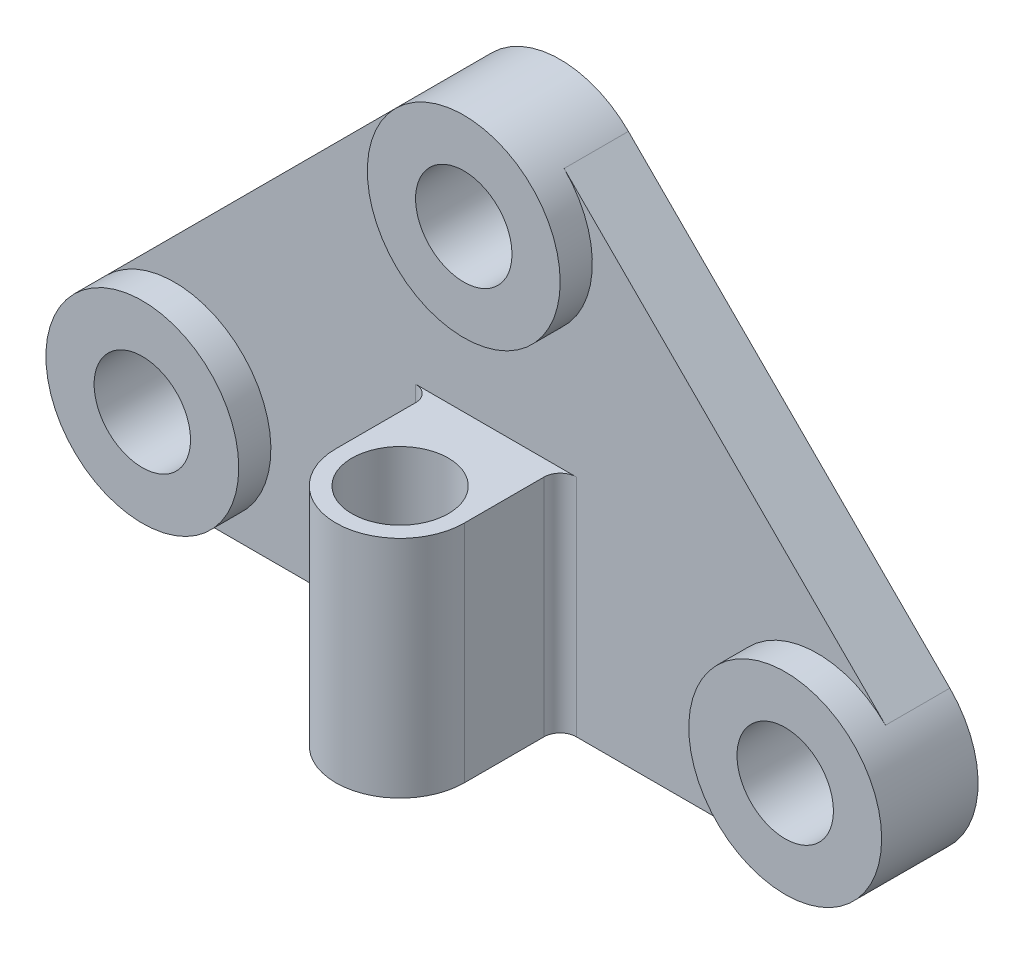
ISO-10303-21;
HEADER;
FILE_DESCRIPTION(('STEP AP214'),'2;1');
FILE_NAME('part.step','',(''),(''),'','','');
FILE_SCHEMA(('AUTOMOTIVE_DESIGN { 1 0 10303 214 1 1 1 1 }'));
ENDSEC;
DATA;
#1=APPLICATION_CONTEXT('core data for automotive mechanical design processes');
#2=APPLICATION_PROTOCOL_DEFINITION('international standard','automotive_design',2000,#1);
#3=PRODUCT_CONTEXT('',#1,'mechanical');
#4=PRODUCT('Part','Part','',(#3));
#5=PRODUCT_RELATED_PRODUCT_CATEGORY('part','',(#4));
#6=PRODUCT_DEFINITION_FORMATION('','',#4);
#7=PRODUCT_DEFINITION_CONTEXT('part definition',#1,'design');
#8=PRODUCT_DEFINITION('design','',#6,#7);
#9=PRODUCT_DEFINITION_SHAPE('','',#8);
#10=(LENGTH_UNIT() NAMED_UNIT(*) SI_UNIT(.MILLI.,.METRE.));
#11=(NAMED_UNIT(*) PLANE_ANGLE_UNIT() SI_UNIT($,.RADIAN.));
#12=(NAMED_UNIT(*) SI_UNIT($,.STERADIAN.) SOLID_ANGLE_UNIT());
#13=UNCERTAINTY_MEASURE_WITH_UNIT(LENGTH_MEASURE(1.E-05),#10,'distance_accuracy_value','');
#14=(GEOMETRIC_REPRESENTATION_CONTEXT(3) GLOBAL_UNCERTAINTY_ASSIGNED_CONTEXT((#13)) GLOBAL_UNIT_ASSIGNED_CONTEXT((#10,
#11,#12)) REPRESENTATION_CONTEXT('',''));
#15=CARTESIAN_POINT('',(0.,0.,0.));
#16=DIRECTION('',(0.,0.,1.));
#17=DIRECTION('',(1.,0.,0.));
#18=AXIS2_PLACEMENT_3D('',#15,#16,#17);
#19=CARTESIAN_POINT('',(-100.,0.,20.));
#20=DIRECTION('',(0.,0.,1.));
#21=DIRECTION('',(1.,0.,0.));
#22=AXIS2_PLACEMENT_3D('',#19,#20,#21);
#23=PLANE('',#22);
#24=DIRECTION('',(1.,0.,0.));
#25=VECTOR('',#24,1.);
#26=CARTESIAN_POINT('',(-100.,-30.,20.));
#27=LINE('',#26,#25);
#28=CARTESIAN_POINT('',(-100.,-30.,20.));
#29=VERTEX_POINT('',#28);
#30=CARTESIAN_POINT('',(-25.,-30.,20.));
#31=VERTEX_POINT('',#30);
#32=EDGE_CURVE('E197',#29,#31,#27,.T.);
#33=ORIENTED_EDGE('',*,*,#32,.T.);
#34=DIRECTION('',(0.,-1.,0.));
#35=VECTOR('',#34,1.);
#36=CARTESIAN_POINT('',(-25.,40.,20.));
#37=LINE('',#36,#35);
#38=CARTESIAN_POINT('',(-25.,40.,20.));
#39=VERTEX_POINT('',#38);
#40=EDGE_CURVE('E244',#31,#39,#37,.F.);
#41=ORIENTED_EDGE('',*,*,#40,.T.);
#42=DIRECTION('',(1.,0.,0.));
#43=VECTOR('',#42,1.);
#44=CARTESIAN_POINT('',(20.,40.,20.));
#45=LINE('',#44,#43);
#46=CARTESIAN_POINT('',(25.,40.,20.));
#47=VERTEX_POINT('',#46);
#48=EDGE_CURVE('E47',#39,#47,#45,.T.);
#49=ORIENTED_EDGE('',*,*,#48,.T.);
#50=DIRECTION('',(0.,-1.,0.));
#51=VECTOR('',#50,1.);
#52=CARTESIAN_POINT('',(25.,-30.,20.));
#53=LINE('',#52,#51);
#54=CARTESIAN_POINT('',(25.,-30.,20.));
#55=VERTEX_POINT('',#54);
#56=EDGE_CURVE('E186',#47,#55,#53,.T.);
#57=ORIENTED_EDGE('',*,*,#56,.T.);
#58=CARTESIAN_POINT('',(100.,-30.,20.));
#59=VERTEX_POINT('',#58);
#60=EDGE_CURVE('E200',#55,#59,#27,.T.);
#61=ORIENTED_EDGE('',*,*,#60,.T.);
#62=CARTESIAN_POINT('',(100.,0.,20.));
#63=DIRECTION('',(0.,0.,1.));
#64=DIRECTION('',(1.,0.,0.));
#65=AXIS2_PLACEMENT_3D('',#62,#63,#64);
#66=CIRCLE('',#65,30.);
#67=CARTESIAN_POINT('',(121.213203435596,21.2132034355964,20.));
#68=VERTEX_POINT('',#67);
#69=EDGE_CURVE('E170',#68,#59,#66,.T.);
#70=ORIENTED_EDGE('',*,*,#69,.F.);
#71=DIRECTION('',(-0.707106781186547,0.707106781186547,0.));
#72=VECTOR('',#71,1.);
#73=CARTESIAN_POINT('',(121.213203435596,21.2132034355964,20.));
#74=LINE('',#73,#72);
#75=CARTESIAN_POINT('',(21.2132034355964,121.213203435596,20.));
#76=VERTEX_POINT('',#75);
#77=EDGE_CURVE('E199',#68,#76,#74,.T.);
#78=ORIENTED_EDGE('',*,*,#77,.T.);
#79=CARTESIAN_POINT('',(0.,100.,20.));
#80=DIRECTION('',(0.,0.,1.));
#81=DIRECTION('',(1.,0.,0.));
#82=AXIS2_PLACEMENT_3D('',#79,#80,#81);
#83=CIRCLE('',#82,30.);
#84=CARTESIAN_POINT('',(-21.2132034355964,121.213203435596,20.));
#85=VERTEX_POINT('',#84);
#86=EDGE_CURVE('E161',#85,#76,#83,.T.);
#87=ORIENTED_EDGE('',*,*,#86,.F.);
#88=DIRECTION('',(-0.707106781186547,-0.707106781186547,0.));
#89=VECTOR('',#88,1.);
#90=CARTESIAN_POINT('',(-121.213203435596,21.2132034355964,20.));
#91=LINE('',#90,#89);
#92=CARTESIAN_POINT('',(-121.213203435596,21.2132034355964,20.));
#93=VERTEX_POINT('',#92);
#94=EDGE_CURVE('E202',#85,#93,#91,.T.);
#95=ORIENTED_EDGE('',*,*,#94,.T.);
#96=CARTESIAN_POINT('',(-100.,0.,20.));
#97=DIRECTION('',(0.,0.,1.));
#98=DIRECTION('',(1.,0.,0.));
#99=AXIS2_PLACEMENT_3D('',#96,#97,#98);
#100=CIRCLE('',#99,30.);
#101=EDGE_CURVE('E183',#29,#93,#100,.T.);
#102=ORIENTED_EDGE('',*,*,#101,.F.);
#103=EDGE_LOOP('',(#33,#41,#49,#57,#61,#70,#78,#87,#95,#102));
#104=FACE_BOUND('',#103,.T.);
#105=ADVANCED_FACE('F33',(#104),#23,.T.);
#106=CARTESIAN_POINT('',(-100.,0.,0.));
#107=DIRECTION('',(0.,0.,1.));
#108=DIRECTION('',(1.,0.,0.));
#109=AXIS2_PLACEMENT_3D('',#106,#107,#108);
#110=PLANE('',#109);
#111=CARTESIAN_POINT('',(-100.,0.,0.));
#112=DIRECTION('',(0.,0.,1.));
#113=DIRECTION('',(1.,0.,0.));
#114=AXIS2_PLACEMENT_3D('',#111,#112,#113);
#115=CIRCLE('',#114,30.);
#116=CARTESIAN_POINT('',(-121.213203435596,21.2132034355964,0.));
#117=VERTEX_POINT('',#116);
#118=CARTESIAN_POINT('',(-100.,-30.,0.));
#119=VERTEX_POINT('',#118);
#120=EDGE_CURVE('E196',#117,#119,#115,.T.);
#121=ORIENTED_EDGE('',*,*,#120,.F.);
#122=DIRECTION('',(-0.707106781186547,-0.707106781186547,0.));
#123=VECTOR('',#122,1.);
#124=CARTESIAN_POINT('',(-121.213203435596,21.2132034355964,0.));
#125=LINE('',#124,#123);
#126=CARTESIAN_POINT('',(-21.2132034355964,121.213203435596,0.));
#127=VERTEX_POINT('',#126);
#128=EDGE_CURVE('E216',#127,#117,#125,.T.);
#129=ORIENTED_EDGE('',*,*,#128,.F.);
#130=CARTESIAN_POINT('',(0.,100.,0.));
#131=DIRECTION('',(0.,0.,1.));
#132=DIRECTION('',(1.,0.,0.));
#133=AXIS2_PLACEMENT_3D('',#130,#131,#132);
#134=CIRCLE('',#133,30.);
#135=CARTESIAN_POINT('',(21.2132034355964,121.213203435596,0.));
#136=VERTEX_POINT('',#135);
#137=EDGE_CURVE('E214',#136,#127,#134,.T.);
#138=ORIENTED_EDGE('',*,*,#137,.F.);
#139=DIRECTION('',(-0.707106781186547,0.707106781186547,0.));
#140=VECTOR('',#139,1.);
#141=CARTESIAN_POINT('',(121.213203435596,21.2132034355964,0.));
#142=LINE('',#141,#140);
#143=CARTESIAN_POINT('',(121.213203435596,21.2132034355964,0.));
#144=VERTEX_POINT('',#143);
#145=EDGE_CURVE('E212',#144,#136,#142,.T.);
#146=ORIENTED_EDGE('',*,*,#145,.F.);
#147=CARTESIAN_POINT('',(100.,0.,0.));
#148=DIRECTION('',(0.,0.,1.));
#149=DIRECTION('',(1.,0.,0.));
#150=AXIS2_PLACEMENT_3D('',#147,#148,#149);
#151=CIRCLE('',#150,30.);
#152=CARTESIAN_POINT('',(100.,-30.,0.));
#153=VERTEX_POINT('',#152);
#154=EDGE_CURVE('E210',#153,#144,#151,.T.);
#155=ORIENTED_EDGE('',*,*,#154,.F.);
#156=DIRECTION('',(1.,0.,0.));
#157=VECTOR('',#156,1.);
#158=CARTESIAN_POINT('',(-100.,-30.,0.));
#159=LINE('',#158,#157);
#160=EDGE_CURVE('E208',#119,#153,#159,.T.);
#161=ORIENTED_EDGE('',*,*,#160,.F.);
#162=EDGE_LOOP('',(#121,#129,#138,#146,#155,#161));
#163=FACE_BOUND('',#162,.T.);
#164=CARTESIAN_POINT('',(100.,0.,0.));
#165=DIRECTION('',(0.,0.,1.));
#166=DIRECTION('',(1.,0.,0.));
#167=AXIS2_PLACEMENT_3D('',#164,#165,#166);
#168=CIRCLE('',#167,15.);
#169=CARTESIAN_POINT('',(115.,0.,0.));
#170=VERTEX_POINT('',#169);
#171=EDGE_CURVE('E193',#170,#170,#168,.T.);
#172=ORIENTED_EDGE('',*,*,#171,.T.);
#173=EDGE_LOOP('',(#172));
#174=FACE_BOUND('',#173,.T.);
#175=CARTESIAN_POINT('',(-100.,0.,0.));
#176=DIRECTION('',(0.,0.,1.));
#177=DIRECTION('',(1.,0.,0.));
#178=AXIS2_PLACEMENT_3D('',#175,#176,#177);
#179=CIRCLE('',#178,15.);
#180=CARTESIAN_POINT('',(-85.,0.,0.));
#181=VERTEX_POINT('',#180);
#182=EDGE_CURVE('E190',#181,#181,#179,.T.);
#183=ORIENTED_EDGE('',*,*,#182,.T.);
#184=EDGE_LOOP('',(#183));
#185=FACE_BOUND('',#184,.T.);
#186=CARTESIAN_POINT('',(0.,100.,0.));
#187=DIRECTION('',(0.,0.,1.));
#188=DIRECTION('',(1.,0.,0.));
#189=AXIS2_PLACEMENT_3D('',#186,#187,#188);
#190=CIRCLE('',#189,15.);
#191=CARTESIAN_POINT('',(15.,100.,0.));
#192=VERTEX_POINT('',#191);
#193=EDGE_CURVE('E182',#192,#192,#190,.T.);
#194=ORIENTED_EDGE('',*,*,#193,.T.);
#195=EDGE_LOOP('',(#194));
#196=FACE_BOUND('',#195,.T.);
#197=ADVANCED_FACE('F281',(#163,#174,#185,#196),#110,.F.);
#198=CARTESIAN_POINT('',(-100.,0.,20.));
#199=DIRECTION('',(0.,0.,-1.));
#200=DIRECTION('',(-1.,0.,0.));
#201=AXIS2_PLACEMENT_3D('',#198,#199,#200);
#202=CYLINDRICAL_SURFACE('',#201,30.);
#203=ORIENTED_EDGE('',*,*,#120,.T.);
#204=DIRECTION('',(0.,0.,-1.));
#205=VECTOR('',#204,1.);
#206=CARTESIAN_POINT('',(-100.,-30.,20.));
#207=LINE('',#206,#205);
#208=EDGE_CURVE('E187',#29,#119,#207,.T.);
#209=ORIENTED_EDGE('',*,*,#208,.F.);
#210=ORIENTED_EDGE('',*,*,#101,.T.);
#211=DIRECTION('',(0.,0.,-1.));
#212=VECTOR('',#211,1.);
#213=CARTESIAN_POINT('',(-121.213203435596,21.2132034355964,20.));
#214=LINE('',#213,#212);
#215=EDGE_CURVE('E205',#93,#117,#214,.T.);
#216=ORIENTED_EDGE('',*,*,#215,.T.);
#217=EDGE_LOOP('',(#203,#209,#210,#216));
#218=FACE_BOUND('',#217,.T.);
#219=CARTESIAN_POINT('',(-100.,0.,30.));
#220=DIRECTION('',(0.,0.,1.));
#221=DIRECTION('',(1.,0.,0.));
#222=AXIS2_PLACEMENT_3D('',#219,#220,#221);
#223=CIRCLE('',#222,30.);
#224=CARTESIAN_POINT('',(-70.,0.,30.));
#225=VERTEX_POINT('',#224);
#226=EDGE_CURVE('E179',#225,#225,#223,.T.);
#227=ORIENTED_EDGE('',*,*,#226,.F.);
#228=EDGE_LOOP('',(#227));
#229=FACE_BOUND('',#228,.T.);
#230=ADVANCED_FACE('F285',(#218,#229),#202,.T.);
#231=CARTESIAN_POINT('',(-100.,-30.,20.));
#232=DIRECTION('',(0.,1.,0.));
#233=DIRECTION('',(0.,0.,1.));
#234=AXIS2_PLACEMENT_3D('',#231,#232,#233);
#235=PLANE('',#234);
#236=ORIENTED_EDGE('',*,*,#160,.T.);
#237=DIRECTION('',(0.,0.,-1.));
#238=VECTOR('',#237,1.);
#239=CARTESIAN_POINT('',(100.,-30.,20.));
#240=LINE('',#239,#238);
#241=EDGE_CURVE('E229',#59,#153,#240,.T.);
#242=ORIENTED_EDGE('',*,*,#241,.F.);
#243=ORIENTED_EDGE('',*,*,#60,.F.);
#244=CARTESIAN_POINT('',(25.,-30.,25.));
#245=DIRECTION('',(0.,1.,0.));
#246=DIRECTION('',(0.,0.,1.));
#247=AXIS2_PLACEMENT_3D('',#244,#245,#246);
#248=CIRCLE('',#247,5.);
#249=CARTESIAN_POINT('',(20.,-30.,25.));
#250=VERTEX_POINT('',#249);
#251=EDGE_CURVE('E238',#55,#250,#248,.T.);
#252=ORIENTED_EDGE('',*,*,#251,.T.);
#253=DIRECTION('',(0.,0.,1.));
#254=VECTOR('',#253,1.);
#255=CARTESIAN_POINT('',(20.,-30.,49.8));
#256=LINE('',#255,#254);
#257=CARTESIAN_POINT('',(20.,-30.,49.8));
#258=VERTEX_POINT('',#257);
#259=EDGE_CURVE('E144',#250,#258,#256,.T.);
#260=ORIENTED_EDGE('',*,*,#259,.T.);
#261=CARTESIAN_POINT('',(0.,-30.,49.8));
#262=DIRECTION('',(0.,-1.,0.));
#263=DIRECTION('',(0.,0.,-1.));
#264=AXIS2_PLACEMENT_3D('',#261,#262,#263);
#265=CIRCLE('',#264,20.);
#266=CARTESIAN_POINT('',(-20.,-30.,49.8));
#267=VERTEX_POINT('',#266);
#268=EDGE_CURVE('E153',#258,#267,#265,.T.);
#269=ORIENTED_EDGE('',*,*,#268,.T.);
#270=DIRECTION('',(0.,0.,-1.));
#271=VECTOR('',#270,1.);
#272=CARTESIAN_POINT('',(-20.,-30.,20.));
#273=LINE('',#272,#271);
#274=CARTESIAN_POINT('',(-20.,-30.,25.));
#275=VERTEX_POINT('',#274);
#276=EDGE_CURVE('E127',#267,#275,#273,.T.);
#277=ORIENTED_EDGE('',*,*,#276,.T.);
#278=CARTESIAN_POINT('',(-25.,-30.,25.));
#279=DIRECTION('',(0.,1.,0.));
#280=DIRECTION('',(0.,0.,1.));
#281=AXIS2_PLACEMENT_3D('',#278,#279,#280);
#282=CIRCLE('',#281,5.);
#283=EDGE_CURVE('E41',#275,#31,#282,.T.);
#284=ORIENTED_EDGE('',*,*,#283,.T.);
#285=ORIENTED_EDGE('',*,*,#32,.F.);
#286=ORIENTED_EDGE('',*,*,#208,.T.);
#287=EDGE_LOOP('',(#236,#242,#243,#252,#260,#269,#277,#284,#285,#286));
#288=FACE_BOUND('',#287,.T.);
#289=CARTESIAN_POINT('',(0.,-30.,49.8));
#290=DIRECTION('',(0.,-1.,0.));
#291=DIRECTION('',(0.,0.,-1.));
#292=AXIS2_PLACEMENT_3D('',#289,#290,#291);
#293=CIRCLE('',#292,15.);
#294=CARTESIAN_POINT('',(0.,-30.,34.8));
#295=VERTEX_POINT('',#294);
#296=EDGE_CURVE('E148',#295,#295,#293,.T.);
#297=ORIENTED_EDGE('',*,*,#296,.F.);
#298=EDGE_LOOP('',(#297));
#299=FACE_BOUND('',#298,.T.);
#300=ADVANCED_FACE('F248',(#288,#299),#235,.F.);
#301=CARTESIAN_POINT('',(100.,0.,20.));
#302=DIRECTION('',(0.,0.,-1.));
#303=DIRECTION('',(-1.,0.,0.));
#304=AXIS2_PLACEMENT_3D('',#301,#302,#303);
#305=CYLINDRICAL_SURFACE('',#304,30.);
#306=ORIENTED_EDGE('',*,*,#154,.T.);
#307=DIRECTION('',(0.,0.,-1.));
#308=VECTOR('',#307,1.);
#309=CARTESIAN_POINT('',(121.213203435596,21.2132034355964,20.));
#310=LINE('',#309,#308);
#311=EDGE_CURVE('E226',#68,#144,#310,.T.);
#312=ORIENTED_EDGE('',*,*,#311,.F.);
#313=ORIENTED_EDGE('',*,*,#69,.T.);
#314=ORIENTED_EDGE('',*,*,#241,.T.);
#315=EDGE_LOOP('',(#306,#312,#313,#314));
#316=FACE_BOUND('',#315,.T.);
#317=CARTESIAN_POINT('',(100.,0.,30.));
#318=DIRECTION('',(0.,0.,1.));
#319=DIRECTION('',(1.,0.,0.));
#320=AXIS2_PLACEMENT_3D('',#317,#318,#319);
#321=CIRCLE('',#320,30.);
#322=CARTESIAN_POINT('',(130.,0.,30.));
#323=VERTEX_POINT('',#322);
#324=EDGE_CURVE('E171',#323,#323,#321,.T.);
#325=ORIENTED_EDGE('',*,*,#324,.F.);
#326=EDGE_LOOP('',(#325));
#327=FACE_BOUND('',#326,.T.);
#328=ADVANCED_FACE('F264',(#316,#327),#305,.T.);
#329=CARTESIAN_POINT('',(121.213203435596,21.2132034355964,20.));
#330=DIRECTION('',(-0.707106781186548,-0.707106781186548,0.));
#331=DIRECTION('',(0.707106781186548,-0.707106781186548,0.));
#332=AXIS2_PLACEMENT_3D('',#329,#330,#331);
#333=PLANE('',#332);
#334=ORIENTED_EDGE('',*,*,#145,.T.);
#335=DIRECTION('',(0.,0.,-1.));
#336=VECTOR('',#335,1.);
#337=CARTESIAN_POINT('',(21.2132034355964,121.213203435596,20.));
#338=LINE('',#337,#336);
#339=EDGE_CURVE('E223',#76,#136,#338,.T.);
#340=ORIENTED_EDGE('',*,*,#339,.F.);
#341=ORIENTED_EDGE('',*,*,#77,.F.);
#342=ORIENTED_EDGE('',*,*,#311,.T.);
#343=EDGE_LOOP('',(#334,#340,#341,#342));
#344=FACE_BOUND('',#343,.T.);
#345=ADVANCED_FACE('F269',(#344),#333,.F.);
#346=CARTESIAN_POINT('',(0.,100.,20.));
#347=DIRECTION('',(0.,0.,-1.));
#348=DIRECTION('',(-1.,0.,0.));
#349=AXIS2_PLACEMENT_3D('',#346,#347,#348);
#350=CYLINDRICAL_SURFACE('',#349,30.);
#351=ORIENTED_EDGE('',*,*,#137,.T.);
#352=DIRECTION('',(0.,0.,-1.));
#353=VECTOR('',#352,1.);
#354=CARTESIAN_POINT('',(-21.2132034355964,121.213203435596,20.));
#355=LINE('',#354,#353);
#356=EDGE_CURVE('E220',#85,#127,#355,.T.);
#357=ORIENTED_EDGE('',*,*,#356,.F.);
#358=ORIENTED_EDGE('',*,*,#86,.T.);
#359=ORIENTED_EDGE('',*,*,#339,.T.);
#360=EDGE_LOOP('',(#351,#357,#358,#359));
#361=FACE_BOUND('',#360,.T.);
#362=CARTESIAN_POINT('',(0.,100.,30.));
#363=DIRECTION('',(0.,0.,1.));
#364=DIRECTION('',(1.,0.,0.));
#365=AXIS2_PLACEMENT_3D('',#362,#363,#364);
#366=CIRCLE('',#365,30.);
#367=CARTESIAN_POINT('',(30.,100.,30.));
#368=VERTEX_POINT('',#367);
#369=EDGE_CURVE('E162',#368,#368,#366,.T.);
#370=ORIENTED_EDGE('',*,*,#369,.F.);
#371=EDGE_LOOP('',(#370));
#372=FACE_BOUND('',#371,.T.);
#373=ADVANCED_FACE('F274',(#361,#372),#350,.T.);
#374=CARTESIAN_POINT('',(-121.213203435596,21.2132034355964,20.));
#375=DIRECTION('',(0.707106781186548,-0.707106781186547,0.));
#376=DIRECTION('',(0.707106781186547,0.707106781186548,0.));
#377=AXIS2_PLACEMENT_3D('',#374,#375,#376);
#378=PLANE('',#377);
#379=ORIENTED_EDGE('',*,*,#128,.T.);
#380=ORIENTED_EDGE('',*,*,#215,.F.);
#381=ORIENTED_EDGE('',*,*,#94,.F.);
#382=ORIENTED_EDGE('',*,*,#356,.T.);
#383=EDGE_LOOP('',(#379,#380,#381,#382));
#384=FACE_BOUND('',#383,.T.);
#385=ADVANCED_FACE('F278',(#384),#378,.F.);
#386=CARTESIAN_POINT('',(100.,0.,20.));
#387=DIRECTION('',(0.,0.,-1.));
#388=DIRECTION('',(-1.,0.,0.));
#389=AXIS2_PLACEMENT_3D('',#386,#387,#388);
#390=CYLINDRICAL_SURFACE('',#389,15.);
#391=ORIENTED_EDGE('',*,*,#171,.F.);
#392=EDGE_LOOP('',(#391));
#393=FACE_BOUND('',#392,.T.);
#394=CARTESIAN_POINT('',(100.,0.,30.));
#395=DIRECTION('',(0.,0.,1.));
#396=DIRECTION('',(1.,0.,0.));
#397=AXIS2_PLACEMENT_3D('',#394,#395,#396);
#398=CIRCLE('',#397,15.);
#399=CARTESIAN_POINT('',(115.,0.,30.));
#400=VERTEX_POINT('',#399);
#401=EDGE_CURVE('E165',#400,#400,#398,.T.);
#402=ORIENTED_EDGE('',*,*,#401,.T.);
#403=EDGE_LOOP('',(#402));
#404=FACE_BOUND('',#403,.T.);
#405=ADVANCED_FACE('F301',(#393,#404),#390,.F.);
#406=CARTESIAN_POINT('',(-100.,0.,20.));
#407=DIRECTION('',(0.,0.,-1.));
#408=DIRECTION('',(-1.,0.,0.));
#409=AXIS2_PLACEMENT_3D('',#406,#407,#408);
#410=CYLINDRICAL_SURFACE('',#409,15.);
#411=ORIENTED_EDGE('',*,*,#182,.F.);
#412=EDGE_LOOP('',(#411));
#413=FACE_BOUND('',#412,.T.);
#414=CARTESIAN_POINT('',(-100.,0.,30.));
#415=DIRECTION('',(0.,0.,1.));
#416=DIRECTION('',(1.,0.,0.));
#417=AXIS2_PLACEMENT_3D('',#414,#415,#416);
#418=CIRCLE('',#417,15.);
#419=CARTESIAN_POINT('',(-85.,0.,30.));
#420=VERTEX_POINT('',#419);
#421=EDGE_CURVE('E174',#420,#420,#418,.T.);
#422=ORIENTED_EDGE('',*,*,#421,.T.);
#423=EDGE_LOOP('',(#422));
#424=FACE_BOUND('',#423,.T.);
#425=ADVANCED_FACE('F299',(#413,#424),#410,.F.);
#426=CARTESIAN_POINT('',(0.,100.,20.));
#427=DIRECTION('',(0.,0.,-1.));
#428=DIRECTION('',(-1.,0.,0.));
#429=AXIS2_PLACEMENT_3D('',#426,#427,#428);
#430=CYLINDRICAL_SURFACE('',#429,15.);
#431=ORIENTED_EDGE('',*,*,#193,.F.);
#432=EDGE_LOOP('',(#431));
#433=FACE_BOUND('',#432,.T.);
#434=CARTESIAN_POINT('',(0.,100.,30.));
#435=DIRECTION('',(0.,0.,1.));
#436=DIRECTION('',(1.,0.,0.));
#437=AXIS2_PLACEMENT_3D('',#434,#435,#436);
#438=CIRCLE('',#437,15.);
#439=CARTESIAN_POINT('',(15.,100.,30.));
#440=VERTEX_POINT('',#439);
#441=EDGE_CURVE('E157',#440,#440,#438,.T.);
#442=ORIENTED_EDGE('',*,*,#441,.T.);
#443=EDGE_LOOP('',(#442));
#444=FACE_BOUND('',#443,.T.);
#445=ADVANCED_FACE('F295',(#433,#444),#430,.F.);
#446=CARTESIAN_POINT('',(-100.,0.,30.));
#447=DIRECTION('',(0.,0.,1.));
#448=DIRECTION('',(1.,0.,0.));
#449=AXIS2_PLACEMENT_3D('',#446,#447,#448);
#450=PLANE('',#449);
#451=ORIENTED_EDGE('',*,*,#226,.T.);
#452=EDGE_LOOP('',(#451));
#453=FACE_BOUND('',#452,.T.);
#454=ORIENTED_EDGE('',*,*,#421,.F.);
#455=EDGE_LOOP('',(#454));
#456=FACE_BOUND('',#455,.T.);
#457=ADVANCED_FACE('F291',(#453,#456),#450,.T.);
#458=CARTESIAN_POINT('',(100.,0.,30.));
#459=DIRECTION('',(0.,0.,1.));
#460=DIRECTION('',(1.,0.,0.));
#461=AXIS2_PLACEMENT_3D('',#458,#459,#460);
#462=PLANE('',#461);
#463=ORIENTED_EDGE('',*,*,#324,.T.);
#464=EDGE_LOOP('',(#463));
#465=FACE_BOUND('',#464,.T.);
#466=ORIENTED_EDGE('',*,*,#401,.F.);
#467=EDGE_LOOP('',(#466));
#468=FACE_BOUND('',#467,.T.);
#469=ADVANCED_FACE('F294',(#465,#468),#462,.T.);
#470=CARTESIAN_POINT('',(0.,100.,30.));
#471=DIRECTION('',(0.,0.,1.));
#472=DIRECTION('',(1.,0.,0.));
#473=AXIS2_PLACEMENT_3D('',#470,#471,#472);
#474=PLANE('',#473);
#475=ORIENTED_EDGE('',*,*,#369,.T.);
#476=EDGE_LOOP('',(#475));
#477=FACE_BOUND('',#476,.T.);
#478=ORIENTED_EDGE('',*,*,#441,.F.);
#479=EDGE_LOOP('',(#478));
#480=FACE_BOUND('',#479,.T.);
#481=ADVANCED_FACE('F351',(#477,#480),#474,.T.);
#482=CARTESIAN_POINT('',(0.,40.,49.8));
#483=DIRECTION('',(0.,-1.,0.));
#484=DIRECTION('',(0.,0.,-1.));
#485=AXIS2_PLACEMENT_3D('',#482,#483,#484);
#486=CYLINDRICAL_SURFACE('',#485,20.);
#487=ORIENTED_EDGE('',*,*,#268,.F.);
#488=DIRECTION('',(0.,-1.,0.));
#489=VECTOR('',#488,1.);
#490=CARTESIAN_POINT('',(20.,40.,49.8));
#491=LINE('',#490,#489);
#492=CARTESIAN_POINT('',(20.,40.,49.8));
#493=VERTEX_POINT('',#492);
#494=EDGE_CURVE('E132',#493,#258,#491,.T.);
#495=ORIENTED_EDGE('',*,*,#494,.F.);
#496=CARTESIAN_POINT('',(0.,40.,49.8));
#497=DIRECTION('',(0.,-1.,0.));
#498=DIRECTION('',(0.,0.,-1.));
#499=AXIS2_PLACEMENT_3D('',#496,#497,#498);
#500=CIRCLE('',#499,20.);
#501=CARTESIAN_POINT('',(-20.,40.,49.8));
#502=VERTEX_POINT('',#501);
#503=EDGE_CURVE('E138',#493,#502,#500,.T.);
#504=ORIENTED_EDGE('',*,*,#503,.T.);
#505=DIRECTION('',(0.,-1.,0.));
#506=VECTOR('',#505,1.);
#507=CARTESIAN_POINT('',(-20.,40.,49.8));
#508=LINE('',#507,#506);
#509=EDGE_CURVE('E121',#502,#267,#508,.T.);
#510=ORIENTED_EDGE('',*,*,#509,.T.);
#511=EDGE_LOOP('',(#487,#495,#504,#510));
#512=FACE_BOUND('',#511,.T.);
#513=ADVANCED_FACE('F142',(#512),#486,.T.);
#514=CARTESIAN_POINT('',(20.,40.,49.8));
#515=DIRECTION('',(1.,0.,0.));
#516=DIRECTION('',(0.,0.,-1.));
#517=AXIS2_PLACEMENT_3D('',#514,#515,#516);
#518=PLANE('',#517);
#519=ORIENTED_EDGE('',*,*,#259,.F.);
#520=DIRECTION('',(0.,-1.,0.));
#521=VECTOR('',#520,1.);
#522=CARTESIAN_POINT('',(20.,40.,25.));
#523=LINE('',#522,#521);
#524=CARTESIAN_POINT('',(20.,40.,25.));
#525=VERTEX_POINT('',#524);
#526=EDGE_CURVE('E236',#250,#525,#523,.F.);
#527=ORIENTED_EDGE('',*,*,#526,.T.);
#528=DIRECTION('',(0.,0.,1.));
#529=VECTOR('',#528,1.);
#530=CARTESIAN_POINT('',(20.,40.,49.8));
#531=LINE('',#530,#529);
#532=EDGE_CURVE('E133',#525,#493,#531,.T.);
#533=ORIENTED_EDGE('',*,*,#532,.T.);
#534=ORIENTED_EDGE('',*,*,#494,.T.);
#535=EDGE_LOOP('',(#519,#527,#533,#534));
#536=FACE_BOUND('',#535,.T.);
#537=ADVANCED_FACE('F254',(#536),#518,.T.);
#538=CARTESIAN_POINT('',(-20.,40.,20.));
#539=DIRECTION('',(-1.,0.,0.));
#540=DIRECTION('',(0.,0.,1.));
#541=AXIS2_PLACEMENT_3D('',#538,#539,#540);
#542=PLANE('',#541);
#543=DIRECTION('',(0.,0.,-1.));
#544=VECTOR('',#543,1.);
#545=CARTESIAN_POINT('',(-20.,40.,20.));
#546=LINE('',#545,#544);
#547=CARTESIAN_POINT('',(-20.,40.,25.));
#548=VERTEX_POINT('',#547);
#549=EDGE_CURVE('E125',#502,#548,#546,.T.);
#550=ORIENTED_EDGE('',*,*,#549,.T.);
#551=DIRECTION('',(0.,-1.,0.));
#552=VECTOR('',#551,1.);
#553=CARTESIAN_POINT('',(-20.,-30.,25.));
#554=LINE('',#553,#552);
#555=EDGE_CURVE('E242',#548,#275,#554,.T.);
#556=ORIENTED_EDGE('',*,*,#555,.T.);
#557=ORIENTED_EDGE('',*,*,#276,.F.);
#558=ORIENTED_EDGE('',*,*,#509,.F.);
#559=EDGE_LOOP('',(#550,#556,#557,#558));
#560=FACE_BOUND('',#559,.T.);
#561=ADVANCED_FACE('F123',(#560),#542,.T.);
#562=CARTESIAN_POINT('',(0.,40.,49.8));
#563=DIRECTION('',(0.,-1.,0.));
#564=DIRECTION('',(0.,0.,-1.));
#565=AXIS2_PLACEMENT_3D('',#562,#563,#564);
#566=PLANE('',#565);
#567=CARTESIAN_POINT('',(0.,40.,49.8));
#568=DIRECTION('',(0.,-1.,0.));
#569=DIRECTION('',(0.,0.,-1.));
#570=AXIS2_PLACEMENT_3D('',#567,#568,#569);
#571=CIRCLE('',#570,15.);
#572=CARTESIAN_POINT('',(0.,40.,34.8));
#573=VERTEX_POINT('',#572);
#574=EDGE_CURVE('E155',#573,#573,#571,.T.);
#575=ORIENTED_EDGE('',*,*,#574,.T.);
#576=EDGE_LOOP('',(#575));
#577=FACE_BOUND('',#576,.T.);
#578=ORIENTED_EDGE('',*,*,#503,.F.);
#579=ORIENTED_EDGE('',*,*,#532,.F.);
#580=CARTESIAN_POINT('',(25.,40.,25.));
#581=DIRECTION('',(0.,-1.,0.));
#582=DIRECTION('',(0.,0.,-1.));
#583=AXIS2_PLACEMENT_3D('',#580,#581,#582);
#584=CIRCLE('',#583,5.);
#585=EDGE_CURVE('E240',#525,#47,#584,.T.);
#586=ORIENTED_EDGE('',*,*,#585,.T.);
#587=ORIENTED_EDGE('',*,*,#48,.F.);
#588=CARTESIAN_POINT('',(-25.,40.,25.));
#589=DIRECTION('',(0.,-1.,0.));
#590=DIRECTION('',(0.,0.,-1.));
#591=AXIS2_PLACEMENT_3D('',#588,#589,#590);
#592=CIRCLE('',#591,5.);
#593=EDGE_CURVE('E11',#39,#548,#592,.T.);
#594=ORIENTED_EDGE('',*,*,#593,.T.);
#595=ORIENTED_EDGE('',*,*,#549,.F.);
#596=EDGE_LOOP('',(#578,#579,#586,#587,#594,#595));
#597=FACE_BOUND('',#596,.T.);
#598=ADVANCED_FACE('F136',(#577,#597),#566,.F.);
#599=CARTESIAN_POINT('',(0.,40.,49.8));
#600=DIRECTION('',(0.,-1.,0.));
#601=DIRECTION('',(0.,0.,-1.));
#602=AXIS2_PLACEMENT_3D('',#599,#600,#601);
#603=CYLINDRICAL_SURFACE('',#602,15.);
#604=ORIENTED_EDGE('',*,*,#574,.F.);
#605=EDGE_LOOP('',(#604));
#606=FACE_BOUND('',#605,.T.);
#607=ORIENTED_EDGE('',*,*,#296,.T.);
#608=EDGE_LOOP('',(#607));
#609=FACE_BOUND('',#608,.T.);
#610=ADVANCED_FACE('F330',(#606,#609),#603,.F.);
#611=CARTESIAN_POINT('',(25.,0.,25.));
#612=DIRECTION('',(0.,1.,0.));
#613=DIRECTION('',(0.,0.,1.));
#614=AXIS2_PLACEMENT_3D('',#611,#612,#613);
#615=CYLINDRICAL_SURFACE('',#614,5.);
#616=ORIENTED_EDGE('',*,*,#585,.F.);
#617=ORIENTED_EDGE('',*,*,#526,.F.);
#618=ORIENTED_EDGE('',*,*,#251,.F.);
#619=ORIENTED_EDGE('',*,*,#56,.F.);
#620=EDGE_LOOP('',(#616,#617,#618,#619));
#621=FACE_BOUND('',#620,.T.);
#622=ADVANCED_FACE('F258',(#621),#615,.F.);
#623=CARTESIAN_POINT('',(-25.,40.,25.));
#624=DIRECTION('',(0.,1.,0.));
#625=DIRECTION('',(0.,0.,1.));
#626=AXIS2_PLACEMENT_3D('',#623,#624,#625);
#627=CYLINDRICAL_SURFACE('',#626,5.);
#628=ORIENTED_EDGE('',*,*,#593,.F.);
#629=ORIENTED_EDGE('',*,*,#40,.F.);
#630=ORIENTED_EDGE('',*,*,#283,.F.);
#631=ORIENTED_EDGE('',*,*,#555,.F.);
#632=EDGE_LOOP('',(#628,#629,#630,#631));
#633=FACE_BOUND('',#632,.T.);
#634=ADVANCED_FACE('F35',(#633),#627,.F.);
#635=CLOSED_SHELL('',(#105,#197,#230,#300,#328,#345,#373,#385,#405,#425,#445,#457,#469,#481,
#513,#537,#561,#598,#610,#622,#634));
#636=MANIFOLD_SOLID_BREP('B2',#635);
#637=ADVANCED_BREP_SHAPE_REPRESENTATION('',(#18,#636),#14);
#638=SHAPE_DEFINITION_REPRESENTATION(#9,#637);
ENDSEC;
END-ISO-10303-21;
